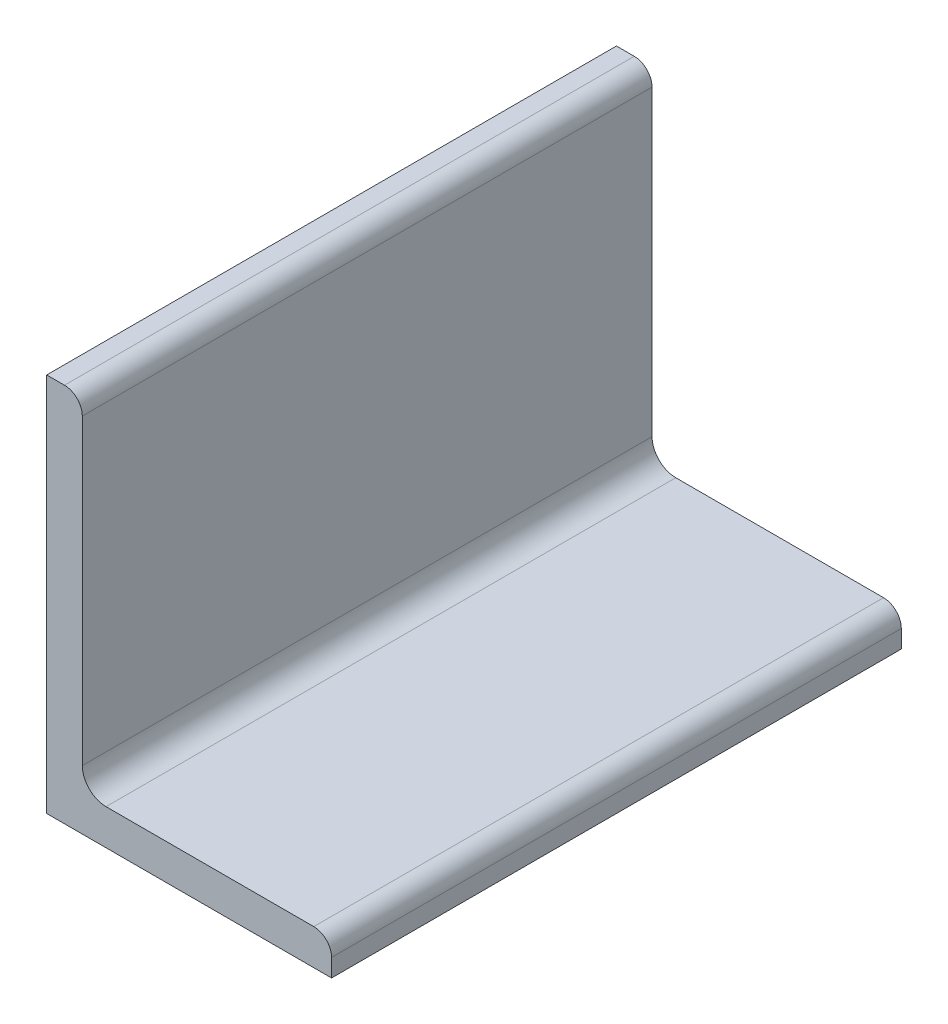
ISO-10303-21;
HEADER;
FILE_DESCRIPTION(('STEP AP214'),'2;1');
FILE_NAME('part.step','',(''),(''),'','','');
FILE_SCHEMA(('AUTOMOTIVE_DESIGN { 1 0 10303 214 1 1 1 1 }'));
ENDSEC;
DATA;
#1=APPLICATION_CONTEXT('core data for automotive mechanical design processes');
#2=APPLICATION_PROTOCOL_DEFINITION('international standard','automotive_design',2000,#1);
#3=PRODUCT_CONTEXT('',#1,'mechanical');
#4=PRODUCT('Part','Part','',(#3));
#5=PRODUCT_RELATED_PRODUCT_CATEGORY('part','',(#4));
#6=PRODUCT_DEFINITION_FORMATION('','',#4);
#7=PRODUCT_DEFINITION_CONTEXT('part definition',#1,'design');
#8=PRODUCT_DEFINITION('design','',#6,#7);
#9=PRODUCT_DEFINITION_SHAPE('','',#8);
#10=(LENGTH_UNIT() NAMED_UNIT(*) SI_UNIT(.MILLI.,.METRE.));
#11=(NAMED_UNIT(*) PLANE_ANGLE_UNIT() SI_UNIT($,.RADIAN.));
#12=(NAMED_UNIT(*) SI_UNIT($,.STERADIAN.) SOLID_ANGLE_UNIT());
#13=UNCERTAINTY_MEASURE_WITH_UNIT(LENGTH_MEASURE(1.E-05),#10,'distance_accuracy_value','');
#14=(GEOMETRIC_REPRESENTATION_CONTEXT(3) GLOBAL_UNCERTAINTY_ASSIGNED_CONTEXT((#13)) GLOBAL_UNIT_ASSIGNED_CONTEXT((#10,
#11,#12)) REPRESENTATION_CONTEXT('',''));
#15=CARTESIAN_POINT('',(0.,0.,0.));
#16=DIRECTION('',(0.,0.,1.));
#17=DIRECTION('',(1.,0.,0.));
#18=AXIS2_PLACEMENT_3D('',#15,#16,#17);
#19=CARTESIAN_POINT('',(0.425014111727251,203.678837479771,304.8));
#20=DIRECTION('',(1.,0.,0.));
#21=DIRECTION('',(0.,0.,-1.));
#22=AXIS2_PLACEMENT_3D('',#19,#20,#21);
#23=PLANE('',#22);
#24=DIRECTION('',(0.,-1.,0.));
#25=VECTOR('',#24,1.);
#26=CARTESIAN_POINT('',(0.425014111727251,203.678837479771,0.));
#27=LINE('',#26,#25);
#28=CARTESIAN_POINT('',(0.425014111727251,203.678837479771,0.));
#29=VERTEX_POINT('',#28);
#30=CARTESIAN_POINT('',(0.425014111727251,0.478837479771347,0.));
#31=VERTEX_POINT('',#30);
#32=EDGE_CURVE('E135',#29,#31,#27,.T.);
#33=ORIENTED_EDGE('',*,*,#32,.T.);
#34=DIRECTION('',(0.,0.,-1.));
#35=VECTOR('',#34,1.);
#36=CARTESIAN_POINT('',(0.425014111727251,0.478837479771347,304.8));
#37=LINE('',#36,#35);
#38=CARTESIAN_POINT('',(0.425014111727251,0.478837479771347,304.8));
#39=VERTEX_POINT('',#38);
#40=EDGE_CURVE('E11',#39,#31,#37,.T.);
#41=ORIENTED_EDGE('',*,*,#40,.F.);
#42=DIRECTION('',(0.,-1.,0.));
#43=VECTOR('',#42,1.);
#44=CARTESIAN_POINT('',(0.425014111727251,203.678837479771,304.8));
#45=LINE('',#44,#43);
#46=CARTESIAN_POINT('',(0.425014111727251,203.678837479771,304.8));
#47=VERTEX_POINT('',#46);
#48=EDGE_CURVE('E151',#47,#39,#45,.T.);
#49=ORIENTED_EDGE('',*,*,#48,.F.);
#50=DIRECTION('',(0.,0.,-1.));
#51=VECTOR('',#50,1.);
#52=CARTESIAN_POINT('',(0.425014111727251,203.678837479771,304.8));
#53=LINE('',#52,#51);
#54=EDGE_CURVE('E131',#47,#29,#53,.T.);
#55=ORIENTED_EDGE('',*,*,#54,.T.);
#56=EDGE_LOOP('',(#33,#41,#49,#55));
#57=FACE_BOUND('',#56,.T.);
#58=ADVANCED_FACE('F33',(#57),#23,.F.);
#59=CARTESIAN_POINT('',(0.425014111727251,0.478837479771347,304.8));
#60=DIRECTION('',(0.,1.,0.));
#61=DIRECTION('',(0.,0.,1.));
#62=AXIS2_PLACEMENT_3D('',#59,#60,#61);
#63=PLANE('',#62);
#64=DIRECTION('',(1.,0.,0.));
#65=VECTOR('',#64,1.);
#66=CARTESIAN_POINT('',(0.425014111727251,0.478837479771347,0.));
#67=LINE('',#66,#65);
#68=CARTESIAN_POINT('',(152.825014111727,0.478837479771347,0.));
#69=VERTEX_POINT('',#68);
#70=EDGE_CURVE('E138',#31,#69,#67,.T.);
#71=ORIENTED_EDGE('',*,*,#70,.T.);
#72=DIRECTION('',(0.,0.,-1.));
#73=VECTOR('',#72,1.);
#74=CARTESIAN_POINT('',(152.825014111727,0.478837479771347,304.8));
#75=LINE('',#74,#73);
#76=CARTESIAN_POINT('',(152.825014111727,0.478837479771347,304.8));
#77=VERTEX_POINT('',#76);
#78=EDGE_CURVE('E41',#77,#69,#75,.T.);
#79=ORIENTED_EDGE('',*,*,#78,.F.);
#80=DIRECTION('',(1.,0.,0.));
#81=VECTOR('',#80,1.);
#82=CARTESIAN_POINT('',(0.425014111727251,0.478837479771347,304.8));
#83=LINE('',#82,#81);
#84=EDGE_CURVE('E95',#39,#77,#83,.T.);
#85=ORIENTED_EDGE('',*,*,#84,.F.);
#86=ORIENTED_EDGE('',*,*,#40,.T.);
#87=EDGE_LOOP('',(#71,#79,#85,#86));
#88=FACE_BOUND('',#87,.T.);
#89=ADVANCED_FACE('F194',(#88),#63,.F.);
#90=CARTESIAN_POINT('',(152.825014111727,0.478837479771347,304.8));
#91=DIRECTION('',(-1.,0.,0.));
#92=DIRECTION('',(0.,0.,1.));
#93=AXIS2_PLACEMENT_3D('',#90,#91,#92);
#94=PLANE('',#93);
#95=DIRECTION('',(0.,1.,0.));
#96=VECTOR('',#95,1.);
#97=CARTESIAN_POINT('',(152.825014111727,0.478837479771347,0.));
#98=LINE('',#97,#96);
#99=CARTESIAN_POINT('',(152.825014111727,10.0038374797713,0.));
#100=VERTEX_POINT('',#99);
#101=EDGE_CURVE('E140',#69,#100,#98,.T.);
#102=ORIENTED_EDGE('',*,*,#101,.T.);
#103=DIRECTION('',(0.,0.,-1.));
#104=VECTOR('',#103,1.);
#105=CARTESIAN_POINT('',(152.825014111727,10.0038374797713,304.8));
#106=LINE('',#105,#104);
#107=CARTESIAN_POINT('',(152.825014111727,10.0038374797713,304.8));
#108=VERTEX_POINT('',#107);
#109=EDGE_CURVE('E161',#108,#100,#106,.T.);
#110=ORIENTED_EDGE('',*,*,#109,.F.);
#111=DIRECTION('',(0.,1.,0.));
#112=VECTOR('',#111,1.);
#113=CARTESIAN_POINT('',(152.825014111727,0.478837479771347,304.8));
#114=LINE('',#113,#112);
#115=EDGE_CURVE('E169',#77,#108,#114,.T.);
#116=ORIENTED_EDGE('',*,*,#115,.F.);
#117=ORIENTED_EDGE('',*,*,#78,.T.);
#118=EDGE_LOOP('',(#102,#110,#116,#117));
#119=FACE_BOUND('',#118,.T.);
#120=ADVANCED_FACE('F167',(#119),#94,.F.);
#121=CARTESIAN_POINT('',(143.300014111727,10.0038374797713,304.8));
#122=DIRECTION('',(0.,0.,-1.));
#123=DIRECTION('',(-1.,0.,0.));
#124=AXIS2_PLACEMENT_3D('',#121,#122,#123);
#125=CYLINDRICAL_SURFACE('',#124,9.52500000000001);
#126=CARTESIAN_POINT('',(143.300014111727,10.0038374797713,0.));
#127=DIRECTION('',(0.,0.,1.));
#128=DIRECTION('',(1.,0.,0.));
#129=AXIS2_PLACEMENT_3D('',#126,#127,#128);
#130=CIRCLE('',#129,9.52500000000001);
#131=CARTESIAN_POINT('',(143.300014111727,19.5288374797713,0.));
#132=VERTEX_POINT('',#131);
#133=EDGE_CURVE('E142',#100,#132,#130,.T.);
#134=ORIENTED_EDGE('',*,*,#133,.T.);
#135=DIRECTION('',(0.,0.,-1.));
#136=VECTOR('',#135,1.);
#137=CARTESIAN_POINT('',(143.300014111727,19.5288374797713,304.8));
#138=LINE('',#137,#136);
#139=CARTESIAN_POINT('',(143.300014111727,19.5288374797713,304.8));
#140=VERTEX_POINT('',#139);
#141=EDGE_CURVE('E158',#140,#132,#138,.T.);
#142=ORIENTED_EDGE('',*,*,#141,.F.);
#143=CARTESIAN_POINT('',(143.300014111727,10.0038374797713,304.8));
#144=DIRECTION('',(0.,0.,1.));
#145=DIRECTION('',(1.,0.,0.));
#146=AXIS2_PLACEMENT_3D('',#143,#144,#145);
#147=CIRCLE('',#146,9.52500000000001);
#148=EDGE_CURVE('E185',#108,#140,#147,.T.);
#149=ORIENTED_EDGE('',*,*,#148,.F.);
#150=ORIENTED_EDGE('',*,*,#109,.T.);
#151=EDGE_LOOP('',(#134,#142,#149,#150));
#152=FACE_BOUND('',#151,.T.);
#153=ADVANCED_FACE('F178',(#152),#125,.T.);
#154=CARTESIAN_POINT('',(143.300014111727,19.5288374797713,304.8));
#155=DIRECTION('',(0.,-1.,0.));
#156=DIRECTION('',(1.,0.,0.));
#157=AXIS2_PLACEMENT_3D('',#154,#155,#156);
#158=PLANE('',#157);
#159=DIRECTION('',(-1.,0.,0.));
#160=VECTOR('',#159,1.);
#161=CARTESIAN_POINT('',(143.300014111727,19.5288374797713,0.));
#162=LINE('',#161,#160);
#163=CARTESIAN_POINT('',(32.1750141117273,19.5288374797714,0.));
#164=VERTEX_POINT('',#163);
#165=EDGE_CURVE('E144',#132,#164,#162,.T.);
#166=ORIENTED_EDGE('',*,*,#165,.T.);
#167=DIRECTION('',(0.,0.,-1.));
#168=VECTOR('',#167,1.);
#169=CARTESIAN_POINT('',(32.1750141117273,19.5288374797714,304.8));
#170=LINE('',#169,#168);
#171=CARTESIAN_POINT('',(32.1750141117273,19.5288374797714,304.8));
#172=VERTEX_POINT('',#171);
#173=EDGE_CURVE('E155',#172,#164,#170,.T.);
#174=ORIENTED_EDGE('',*,*,#173,.F.);
#175=DIRECTION('',(-1.,0.,0.));
#176=VECTOR('',#175,1.);
#177=CARTESIAN_POINT('',(143.300014111727,19.5288374797713,304.8));
#178=LINE('',#177,#176);
#179=EDGE_CURVE('E184',#140,#172,#178,.T.);
#180=ORIENTED_EDGE('',*,*,#179,.F.);
#181=ORIENTED_EDGE('',*,*,#141,.T.);
#182=EDGE_LOOP('',(#166,#174,#180,#181));
#183=FACE_BOUND('',#182,.T.);
#184=ADVANCED_FACE('F182',(#183),#158,.F.);
#185=CARTESIAN_POINT('',(32.1750141117272,32.2288374797714,304.8));
#186=DIRECTION('',(0.,0.,-1.));
#187=DIRECTION('',(-1.,0.,0.));
#188=AXIS2_PLACEMENT_3D('',#185,#186,#187);
#189=CYLINDRICAL_SURFACE('',#188,12.7);
#190=CARTESIAN_POINT('',(32.1750141117272,32.2288374797714,0.));
#191=DIRECTION('',(0.,0.,-1.));
#192=DIRECTION('',(1.,0.,0.));
#193=AXIS2_PLACEMENT_3D('',#190,#191,#192);
#194=CIRCLE('',#193,12.7);
#195=CARTESIAN_POINT('',(19.4750141117273,32.2288374797714,0.));
#196=VERTEX_POINT('',#195);
#197=EDGE_CURVE('E146',#164,#196,#194,.T.);
#198=ORIENTED_EDGE('',*,*,#197,.T.);
#199=DIRECTION('',(0.,0.,-1.));
#200=VECTOR('',#199,1.);
#201=CARTESIAN_POINT('',(19.4750141117273,32.2288374797714,304.8));
#202=LINE('',#201,#200);
#203=CARTESIAN_POINT('',(19.4750141117273,32.2288374797714,304.8));
#204=VERTEX_POINT('',#203);
#205=EDGE_CURVE('E126',#204,#196,#202,.T.);
#206=ORIENTED_EDGE('',*,*,#205,.F.);
#207=CARTESIAN_POINT('',(32.1750141117272,32.2288374797714,304.8));
#208=DIRECTION('',(0.,0.,-1.));
#209=DIRECTION('',(1.,0.,0.));
#210=AXIS2_PLACEMENT_3D('',#207,#208,#209);
#211=CIRCLE('',#210,12.7);
#212=EDGE_CURVE('E117',#172,#204,#211,.T.);
#213=ORIENTED_EDGE('',*,*,#212,.F.);
#214=ORIENTED_EDGE('',*,*,#173,.T.);
#215=EDGE_LOOP('',(#198,#206,#213,#214));
#216=FACE_BOUND('',#215,.T.);
#217=ADVANCED_FACE('F206',(#216),#189,.F.);
#218=CARTESIAN_POINT('',(19.4750141117273,32.2288374797714,304.8));
#219=DIRECTION('',(-1.,0.,0.));
#220=DIRECTION('',(0.,0.,1.));
#221=AXIS2_PLACEMENT_3D('',#218,#219,#220);
#222=PLANE('',#221);
#223=DIRECTION('',(0.,1.,0.));
#224=VECTOR('',#223,1.);
#225=CARTESIAN_POINT('',(19.4750141117273,32.2288374797714,0.));
#226=LINE('',#225,#224);
#227=CARTESIAN_POINT('',(19.4750141117273,194.153837479771,0.));
#228=VERTEX_POINT('',#227);
#229=EDGE_CURVE('E125',#196,#228,#226,.T.);
#230=ORIENTED_EDGE('',*,*,#229,.T.);
#231=DIRECTION('',(0.,0.,-1.));
#232=VECTOR('',#231,1.);
#233=CARTESIAN_POINT('',(19.4750141117273,194.153837479771,304.8));
#234=LINE('',#233,#232);
#235=CARTESIAN_POINT('',(19.4750141117273,194.153837479771,304.8));
#236=VERTEX_POINT('',#235);
#237=EDGE_CURVE('E122',#236,#228,#234,.T.);
#238=ORIENTED_EDGE('',*,*,#237,.F.);
#239=DIRECTION('',(0.,1.,0.));
#240=VECTOR('',#239,1.);
#241=CARTESIAN_POINT('',(19.4750141117273,32.2288374797714,304.8));
#242=LINE('',#241,#240);
#243=EDGE_CURVE('E111',#204,#236,#242,.T.);
#244=ORIENTED_EDGE('',*,*,#243,.F.);
#245=ORIENTED_EDGE('',*,*,#205,.T.);
#246=EDGE_LOOP('',(#230,#238,#244,#245));
#247=FACE_BOUND('',#246,.T.);
#248=ADVANCED_FACE('F123',(#247),#222,.F.);
#249=CARTESIAN_POINT('',(9.95001411172724,194.153837479771,304.8));
#250=DIRECTION('',(0.,0.,-1.));
#251=DIRECTION('',(-1.,0.,0.));
#252=AXIS2_PLACEMENT_3D('',#249,#250,#251);
#253=CYLINDRICAL_SURFACE('',#252,9.52500000000001);
#254=CARTESIAN_POINT('',(9.95001411172724,194.153837479771,0.));
#255=DIRECTION('',(0.,0.,1.));
#256=DIRECTION('',(1.,0.,0.));
#257=AXIS2_PLACEMENT_3D('',#254,#255,#256);
#258=CIRCLE('',#257,9.52500000000001);
#259=CARTESIAN_POINT('',(9.95001411172725,203.678837479771,0.));
#260=VERTEX_POINT('',#259);
#261=EDGE_CURVE('E81',#228,#260,#258,.T.);
#262=ORIENTED_EDGE('',*,*,#261,.T.);
#263=DIRECTION('',(0.,0.,-1.));
#264=VECTOR('',#263,1.);
#265=CARTESIAN_POINT('',(9.95001411172725,203.678837479771,304.8));
#266=LINE('',#265,#264);
#267=CARTESIAN_POINT('',(9.95001411172725,203.678837479771,304.8));
#268=VERTEX_POINT('',#267);
#269=EDGE_CURVE('E127',#268,#260,#266,.T.);
#270=ORIENTED_EDGE('',*,*,#269,.F.);
#271=CARTESIAN_POINT('',(9.95001411172724,194.153837479771,304.8));
#272=DIRECTION('',(0.,0.,1.));
#273=DIRECTION('',(1.,0.,0.));
#274=AXIS2_PLACEMENT_3D('',#271,#272,#273);
#275=CIRCLE('',#274,9.52500000000001);
#276=EDGE_CURVE('E115',#236,#268,#275,.T.);
#277=ORIENTED_EDGE('',*,*,#276,.F.);
#278=ORIENTED_EDGE('',*,*,#237,.T.);
#279=EDGE_LOOP('',(#262,#270,#277,#278));
#280=FACE_BOUND('',#279,.T.);
#281=ADVANCED_FACE('F129',(#280),#253,.T.);
#282=CARTESIAN_POINT('',(9.95001411172725,203.678837479771,304.8));
#283=DIRECTION('',(0.,-1.,0.));
#284=DIRECTION('',(0.,0.,-1.));
#285=AXIS2_PLACEMENT_3D('',#282,#283,#284);
#286=PLANE('',#285);
#287=DIRECTION('',(-1.,0.,0.));
#288=VECTOR('',#287,1.);
#289=CARTESIAN_POINT('',(9.95001411172725,203.678837479771,0.));
#290=LINE('',#289,#288);
#291=EDGE_CURVE('E87',#260,#29,#290,.T.);
#292=ORIENTED_EDGE('',*,*,#291,.T.);
#293=ORIENTED_EDGE('',*,*,#54,.F.);
#294=DIRECTION('',(-1.,0.,0.));
#295=VECTOR('',#294,1.);
#296=CARTESIAN_POINT('',(9.95001411172725,203.678837479771,304.8));
#297=LINE('',#296,#295);
#298=EDGE_CURVE('E49',#268,#47,#297,.T.);
#299=ORIENTED_EDGE('',*,*,#298,.F.);
#300=ORIENTED_EDGE('',*,*,#269,.T.);
#301=EDGE_LOOP('',(#292,#293,#299,#300));
#302=FACE_BOUND('',#301,.T.);
#303=ADVANCED_FACE('F214',(#302),#286,.F.);
#304=CARTESIAN_POINT('',(143.300014111727,10.0038374797713,304.8));
#305=DIRECTION('',(0.,0.,1.));
#306=DIRECTION('',(1.,0.,0.));
#307=AXIS2_PLACEMENT_3D('',#304,#305,#306);
#308=PLANE('',#307);
#309=ORIENTED_EDGE('',*,*,#48,.T.);
#310=ORIENTED_EDGE('',*,*,#84,.T.);
#311=ORIENTED_EDGE('',*,*,#115,.T.);
#312=ORIENTED_EDGE('',*,*,#148,.T.);
#313=ORIENTED_EDGE('',*,*,#179,.T.);
#314=ORIENTED_EDGE('',*,*,#212,.T.);
#315=ORIENTED_EDGE('',*,*,#243,.T.);
#316=ORIENTED_EDGE('',*,*,#276,.T.);
#317=ORIENTED_EDGE('',*,*,#298,.T.);
#318=EDGE_LOOP('',(#309,#310,#311,#312,#313,#314,#315,#316,#317));
#319=FACE_BOUND('',#318,.T.);
#320=ADVANCED_FACE('F113',(#319),#308,.T.);
#321=CARTESIAN_POINT('',(143.300014111727,10.0038374797713,0.));
#322=DIRECTION('',(0.,0.,1.));
#323=DIRECTION('',(1.,0.,0.));
#324=AXIS2_PLACEMENT_3D('',#321,#322,#323);
#325=PLANE('',#324);
#326=ORIENTED_EDGE('',*,*,#32,.F.);
#327=ORIENTED_EDGE('',*,*,#291,.F.);
#328=ORIENTED_EDGE('',*,*,#261,.F.);
#329=ORIENTED_EDGE('',*,*,#229,.F.);
#330=ORIENTED_EDGE('',*,*,#197,.F.);
#331=ORIENTED_EDGE('',*,*,#165,.F.);
#332=ORIENTED_EDGE('',*,*,#133,.F.);
#333=ORIENTED_EDGE('',*,*,#101,.F.);
#334=ORIENTED_EDGE('',*,*,#70,.F.);
#335=EDGE_LOOP('',(#326,#327,#328,#329,#330,#331,#332,#333,#334));
#336=FACE_BOUND('',#335,.T.);
#337=ADVANCED_FACE('F173',(#336),#325,.F.);
#338=CLOSED_SHELL('',(#58,#89,#120,#153,#184,#217,#248,#281,#303,#320,#337));
#339=MANIFOLD_SOLID_BREP('B2',#338);
#340=ADVANCED_BREP_SHAPE_REPRESENTATION('',(#18,#339),#14);
#341=SHAPE_DEFINITION_REPRESENTATION(#9,#340);
ENDSEC;
END-ISO-10303-21;
